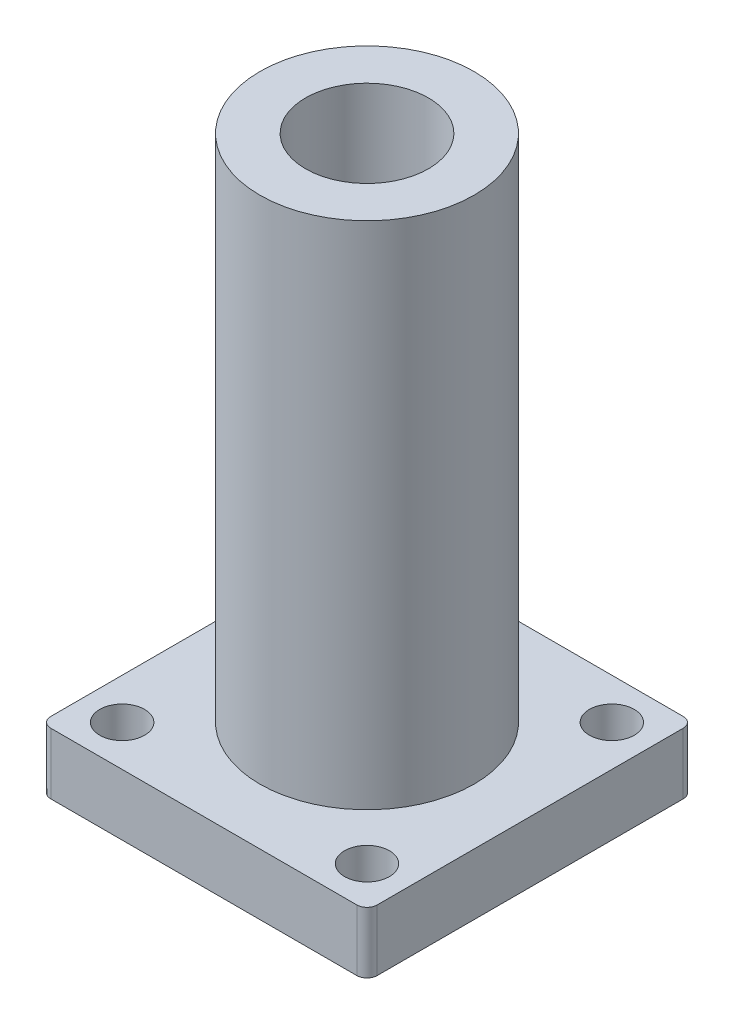
ISO-10303-21;
HEADER;
FILE_DESCRIPTION(('STEP AP214'),'2;1');
FILE_NAME('part.step','',(''),(''),'','','');
FILE_SCHEMA(('AUTOMOTIVE_DESIGN { 1 0 10303 214 1 1 1 1 }'));
ENDSEC;
DATA;
#1=APPLICATION_CONTEXT('core data for automotive mechanical design processes');
#2=APPLICATION_PROTOCOL_DEFINITION('international standard','automotive_design',2000,#1);
#3=PRODUCT_CONTEXT('',#1,'mechanical');
#4=PRODUCT('Part','Part','',(#3));
#5=PRODUCT_RELATED_PRODUCT_CATEGORY('part','',(#4));
#6=PRODUCT_DEFINITION_FORMATION('','',#4);
#7=PRODUCT_DEFINITION_CONTEXT('part definition',#1,'design');
#8=PRODUCT_DEFINITION('design','',#6,#7);
#9=PRODUCT_DEFINITION_SHAPE('','',#8);
#10=(LENGTH_UNIT() NAMED_UNIT(*) SI_UNIT(.MILLI.,.METRE.));
#11=(NAMED_UNIT(*) PLANE_ANGLE_UNIT() SI_UNIT($,.RADIAN.));
#12=(NAMED_UNIT(*) SI_UNIT($,.STERADIAN.) SOLID_ANGLE_UNIT());
#13=UNCERTAINTY_MEASURE_WITH_UNIT(LENGTH_MEASURE(1.E-05),#10,'distance_accuracy_value','');
#14=(GEOMETRIC_REPRESENTATION_CONTEXT(3) GLOBAL_UNCERTAINTY_ASSIGNED_CONTEXT((#13)) GLOBAL_UNIT_ASSIGNED_CONTEXT((#10,
#11,#12)) REPRESENTATION_CONTEXT('',''));
#15=CARTESIAN_POINT('',(0.,0.,0.));
#16=DIRECTION('',(0.,0.,1.));
#17=DIRECTION('',(1.,0.,0.));
#18=AXIS2_PLACEMENT_3D('',#15,#16,#17);
#19=CARTESIAN_POINT('',(0.,6.,-32.));
#20=DIRECTION('',(0.,0.,-1.));
#21=DIRECTION('',(-1.,0.,0.));
#22=AXIS2_PLACEMENT_3D('',#19,#20,#21);
#23=PLANE('',#22);
#24=DIRECTION('',(1.,0.,0.));
#25=VECTOR('',#24,1.);
#26=CARTESIAN_POINT('',(0.,6.,-32.));
#27=LINE('',#26,#25);
#28=CARTESIAN_POINT('',(0.999999999999999,6.,-32.));
#29=VERTEX_POINT('',#28);
#30=CARTESIAN_POINT('',(31.,6.,-32.));
#31=VERTEX_POINT('',#30);
#32=EDGE_CURVE('E155',#29,#31,#27,.T.);
#33=ORIENTED_EDGE('',*,*,#32,.T.);
#34=DIRECTION('',(0.,-1.,0.));
#35=VECTOR('',#34,1.);
#36=CARTESIAN_POINT('',(31.,6.,-32.));
#37=LINE('',#36,#35);
#38=CARTESIAN_POINT('',(31.,0.,-32.));
#39=VERTEX_POINT('',#38);
#40=EDGE_CURVE('E151',#31,#39,#37,.T.);
#41=ORIENTED_EDGE('',*,*,#40,.T.);
#42=DIRECTION('',(1.,0.,0.));
#43=VECTOR('',#42,1.);
#44=CARTESIAN_POINT('',(0.,0.,-32.));
#45=LINE('',#44,#43);
#46=CARTESIAN_POINT('',(0.999999999999999,0.,-32.));
#47=VERTEX_POINT('',#46);
#48=EDGE_CURVE('E103',#47,#39,#45,.T.);
#49=ORIENTED_EDGE('',*,*,#48,.F.);
#50=DIRECTION('',(0.,-1.,0.));
#51=VECTOR('',#50,1.);
#52=CARTESIAN_POINT('',(0.999999999999999,6.,-32.));
#53=LINE('',#52,#51);
#54=EDGE_CURVE('E149',#47,#29,#53,.F.);
#55=ORIENTED_EDGE('',*,*,#54,.T.);
#56=EDGE_LOOP('',(#33,#41,#49,#55));
#57=FACE_BOUND('',#56,.T.);
#58=ADVANCED_FACE('F32',(#57),#23,.T.);
#59=CARTESIAN_POINT('',(0.,6.,0.));
#60=DIRECTION('',(-1.,0.,0.));
#61=DIRECTION('',(0.,0.,1.));
#62=AXIS2_PLACEMENT_3D('',#59,#60,#61);
#63=PLANE('',#62);
#64=DIRECTION('',(0.,0.,-1.));
#65=VECTOR('',#64,1.);
#66=CARTESIAN_POINT('',(0.,6.,0.));
#67=LINE('',#66,#65);
#68=CARTESIAN_POINT('',(0.,6.,-1.));
#69=VERTEX_POINT('',#68);
#70=CARTESIAN_POINT('',(0.,6.,-31.));
#71=VERTEX_POINT('',#70);
#72=EDGE_CURVE('E129',#69,#71,#67,.T.);
#73=ORIENTED_EDGE('',*,*,#72,.T.);
#74=DIRECTION('',(0.,-1.,0.));
#75=VECTOR('',#74,1.);
#76=CARTESIAN_POINT('',(0.,6.,-31.));
#77=LINE('',#76,#75);
#78=CARTESIAN_POINT('',(0.,0.,-31.));
#79=VERTEX_POINT('',#78);
#80=EDGE_CURVE('E11',#71,#79,#77,.T.);
#81=ORIENTED_EDGE('',*,*,#80,.T.);
#82=DIRECTION('',(0.,0.,-1.));
#83=VECTOR('',#82,1.);
#84=CARTESIAN_POINT('',(0.,0.,0.));
#85=LINE('',#84,#83);
#86=CARTESIAN_POINT('',(0.,0.,-1.));
#87=VERTEX_POINT('',#86);
#88=EDGE_CURVE('E157',#87,#79,#85,.T.);
#89=ORIENTED_EDGE('',*,*,#88,.F.);
#90=DIRECTION('',(0.,-1.,0.));
#91=VECTOR('',#90,1.);
#92=CARTESIAN_POINT('',(0.,6.,-1.));
#93=LINE('',#92,#91);
#94=EDGE_CURVE('E40',#87,#69,#93,.F.);
#95=ORIENTED_EDGE('',*,*,#94,.T.);
#96=EDGE_LOOP('',(#73,#81,#89,#95));
#97=FACE_BOUND('',#96,.T.);
#98=ADVANCED_FACE('F189',(#97),#63,.T.);
#99=CARTESIAN_POINT('',(32.,6.,0.));
#100=DIRECTION('',(0.,0.,1.));
#101=DIRECTION('',(1.,0.,0.));
#102=AXIS2_PLACEMENT_3D('',#99,#100,#101);
#103=PLANE('',#102);
#104=DIRECTION('',(-1.,0.,0.));
#105=VECTOR('',#104,1.);
#106=CARTESIAN_POINT('',(32.,0.,0.));
#107=LINE('',#106,#105);
#108=CARTESIAN_POINT('',(31.,0.,0.));
#109=VERTEX_POINT('',#108);
#110=CARTESIAN_POINT('',(1.,0.,0.));
#111=VERTEX_POINT('',#110);
#112=EDGE_CURVE('E119',#109,#111,#107,.T.);
#113=ORIENTED_EDGE('',*,*,#112,.F.);
#114=DIRECTION('',(0.,-1.,0.));
#115=VECTOR('',#114,1.);
#116=CARTESIAN_POINT('',(31.,6.,0.));
#117=LINE('',#116,#115);
#118=CARTESIAN_POINT('',(31.,6.,0.));
#119=VERTEX_POINT('',#118);
#120=EDGE_CURVE('E141',#109,#119,#117,.F.);
#121=ORIENTED_EDGE('',*,*,#120,.T.);
#122=DIRECTION('',(-1.,0.,0.));
#123=VECTOR('',#122,1.);
#124=CARTESIAN_POINT('',(32.,6.,0.));
#125=LINE('',#124,#123);
#126=CARTESIAN_POINT('',(1.,6.,0.));
#127=VERTEX_POINT('',#126);
#128=EDGE_CURVE('E159',#119,#127,#125,.T.);
#129=ORIENTED_EDGE('',*,*,#128,.T.);
#130=DIRECTION('',(0.,-1.,0.));
#131=VECTOR('',#130,1.);
#132=CARTESIAN_POINT('',(1.,6.,0.));
#133=LINE('',#132,#131);
#134=EDGE_CURVE('E138',#127,#111,#133,.T.);
#135=ORIENTED_EDGE('',*,*,#134,.T.);
#136=EDGE_LOOP('',(#113,#121,#129,#135));
#137=FACE_BOUND('',#136,.T.);
#138=ADVANCED_FACE('F173',(#137),#103,.T.);
#139=CARTESIAN_POINT('',(32.,6.,-32.));
#140=DIRECTION('',(1.,0.,0.));
#141=DIRECTION('',(0.,0.,-1.));
#142=AXIS2_PLACEMENT_3D('',#139,#140,#141);
#143=PLANE('',#142);
#144=DIRECTION('',(0.,0.,1.));
#145=VECTOR('',#144,1.);
#146=CARTESIAN_POINT('',(32.,6.,-32.));
#147=LINE('',#146,#145);
#148=CARTESIAN_POINT('',(32.,6.,-31.));
#149=VERTEX_POINT('',#148);
#150=CARTESIAN_POINT('',(32.,6.,-1.));
#151=VERTEX_POINT('',#150);
#152=EDGE_CURVE('E156',#149,#151,#147,.T.);
#153=ORIENTED_EDGE('',*,*,#152,.T.);
#154=DIRECTION('',(0.,-1.,0.));
#155=VECTOR('',#154,1.);
#156=CARTESIAN_POINT('',(32.,6.,-1.));
#157=LINE('',#156,#155);
#158=CARTESIAN_POINT('',(32.,0.,-1.));
#159=VERTEX_POINT('',#158);
#160=EDGE_CURVE('E118',#151,#159,#157,.T.);
#161=ORIENTED_EDGE('',*,*,#160,.T.);
#162=DIRECTION('',(0.,0.,1.));
#163=VECTOR('',#162,1.);
#164=CARTESIAN_POINT('',(32.,0.,-32.));
#165=LINE('',#164,#163);
#166=CARTESIAN_POINT('',(32.,0.,-31.));
#167=VERTEX_POINT('',#166);
#168=EDGE_CURVE('E101',#167,#159,#165,.T.);
#169=ORIENTED_EDGE('',*,*,#168,.F.);
#170=DIRECTION('',(0.,-1.,0.));
#171=VECTOR('',#170,1.);
#172=CARTESIAN_POINT('',(32.,6.,-31.));
#173=LINE('',#172,#171);
#174=EDGE_CURVE('E115',#167,#149,#173,.F.);
#175=ORIENTED_EDGE('',*,*,#174,.T.);
#176=EDGE_LOOP('',(#153,#161,#169,#175));
#177=FACE_BOUND('',#176,.T.);
#178=ADVANCED_FACE('F114',(#177),#143,.T.);
#179=CARTESIAN_POINT('',(0.,6.,0.));
#180=DIRECTION('',(0.,-1.,0.));
#181=DIRECTION('',(0.,0.,-1.));
#182=AXIS2_PLACEMENT_3D('',#179,#180,#181);
#183=PLANE('',#182);
#184=CARTESIAN_POINT('',(28.,6.,-4.));
#185=DIRECTION('',(0.,-1.,0.));
#186=DIRECTION('',(0.,0.,-1.));
#187=AXIS2_PLACEMENT_3D('',#184,#185,#186);
#188=CIRCLE('',#187,2.19999999999999);
#189=CARTESIAN_POINT('',(28.,6.,-6.19999999999999));
#190=VERTEX_POINT('',#189);
#191=EDGE_CURVE('E338',#190,#190,#188,.T.);
#192=ORIENTED_EDGE('',*,*,#191,.T.);
#193=EDGE_LOOP('',(#192));
#194=FACE_BOUND('',#193,.T.);
#195=CARTESIAN_POINT('',(28.,6.,-28.));
#196=DIRECTION('',(0.,-1.,0.));
#197=DIRECTION('',(0.,0.,-1.));
#198=AXIS2_PLACEMENT_3D('',#195,#196,#197);
#199=CIRCLE('',#198,2.19999999999999);
#200=CARTESIAN_POINT('',(28.,6.,-30.2));
#201=VERTEX_POINT('',#200);
#202=EDGE_CURVE('E342',#201,#201,#199,.T.);
#203=ORIENTED_EDGE('',*,*,#202,.T.);
#204=EDGE_LOOP('',(#203));
#205=FACE_BOUND('',#204,.T.);
#206=CARTESIAN_POINT('',(4.00000005960464,6.,-4.00000005960464));
#207=DIRECTION('',(0.,-1.,0.));
#208=DIRECTION('',(0.,0.,-1.));
#209=AXIS2_PLACEMENT_3D('',#206,#207,#208);
#210=CIRCLE('',#209,2.19999999999999);
#211=CARTESIAN_POINT('',(4.00000005960464,6.,-6.20000005960463));
#212=VERTEX_POINT('',#211);
#213=EDGE_CURVE('E346',#212,#212,#210,.T.);
#214=ORIENTED_EDGE('',*,*,#213,.T.);
#215=EDGE_LOOP('',(#214));
#216=FACE_BOUND('',#215,.T.);
#217=CARTESIAN_POINT('',(4.00000005960464,6.,-28.0000004172325));
#218=DIRECTION('',(0.,-1.,0.));
#219=DIRECTION('',(0.,0.,-1.));
#220=AXIS2_PLACEMENT_3D('',#217,#218,#219);
#221=CIRCLE('',#220,2.19999999999999);
#222=CARTESIAN_POINT('',(4.00000005960464,6.,-30.2000004172325));
#223=VERTEX_POINT('',#222);
#224=EDGE_CURVE('E132',#223,#223,#221,.T.);
#225=ORIENTED_EDGE('',*,*,#224,.T.);
#226=EDGE_LOOP('',(#225));
#227=FACE_BOUND('',#226,.T.);
#228=CARTESIAN_POINT('',(16.0000002384186,6.,-16.0000002384186));
#229=DIRECTION('',(0.,1.,0.));
#230=DIRECTION('',(0.,0.,1.));
#231=AXIS2_PLACEMENT_3D('',#228,#229,#230);
#232=CIRCLE('',#231,10.5);
#233=CARTESIAN_POINT('',(16.0000002384186,6.,-5.50000023841861));
#234=VERTEX_POINT('',#233);
#235=EDGE_CURVE('E124',#234,#234,#232,.T.);
#236=ORIENTED_EDGE('',*,*,#235,.F.);
#237=EDGE_LOOP('',(#236));
#238=FACE_BOUND('',#237,.T.);
#239=ORIENTED_EDGE('',*,*,#128,.F.);
#240=CARTESIAN_POINT('',(31.,6.,-1.));
#241=DIRECTION('',(0.,-1.,0.));
#242=DIRECTION('',(0.,0.,-1.));
#243=AXIS2_PLACEMENT_3D('',#240,#241,#242);
#244=CIRCLE('',#243,1.);
#245=EDGE_CURVE('E147',#119,#151,#244,.F.);
#246=ORIENTED_EDGE('',*,*,#245,.T.);
#247=ORIENTED_EDGE('',*,*,#152,.F.);
#248=CARTESIAN_POINT('',(31.,6.,-31.));
#249=DIRECTION('',(0.,-1.,0.));
#250=DIRECTION('',(0.,0.,-1.));
#251=AXIS2_PLACEMENT_3D('',#248,#249,#250);
#252=CIRCLE('',#251,1.);
#253=EDGE_CURVE('E123',#149,#31,#252,.F.);
#254=ORIENTED_EDGE('',*,*,#253,.T.);
#255=ORIENTED_EDGE('',*,*,#32,.F.);
#256=CARTESIAN_POINT('',(0.999999999999999,6.,-31.));
#257=DIRECTION('',(0.,-1.,0.));
#258=DIRECTION('',(0.,0.,-1.));
#259=AXIS2_PLACEMENT_3D('',#256,#257,#258);
#260=CIRCLE('',#259,1.);
#261=EDGE_CURVE('E47',#29,#71,#260,.F.);
#262=ORIENTED_EDGE('',*,*,#261,.T.);
#263=ORIENTED_EDGE('',*,*,#72,.F.);
#264=CARTESIAN_POINT('',(1.,6.,-1.));
#265=DIRECTION('',(0.,-1.,0.));
#266=DIRECTION('',(0.,0.,-1.));
#267=AXIS2_PLACEMENT_3D('',#264,#265,#266);
#268=CIRCLE('',#267,1.);
#269=EDGE_CURVE('E143',#69,#127,#268,.F.);
#270=ORIENTED_EDGE('',*,*,#269,.T.);
#271=EDGE_LOOP('',(#239,#246,#247,#254,#255,#262,#263,#270));
#272=FACE_BOUND('',#271,.T.);
#273=ADVANCED_FACE('F179',(#194,#205,#216,#227,#238,#272),#183,.F.);
#274=CARTESIAN_POINT('',(0.,0.,0.));
#275=DIRECTION('',(0.,-1.,0.));
#276=DIRECTION('',(0.,0.,-1.));
#277=AXIS2_PLACEMENT_3D('',#274,#275,#276);
#278=PLANE('',#277);
#279=CARTESIAN_POINT('',(16.0000002384186,0.,-16.0000002384186));
#280=DIRECTION('',(0.,1.,0.));
#281=DIRECTION('',(0.,0.,1.));
#282=AXIS2_PLACEMENT_3D('',#279,#280,#281);
#283=CIRCLE('',#282,6.02500000000001);
#284=CARTESIAN_POINT('',(16.0000002384186,0.,-9.97500023841859));
#285=VERTEX_POINT('',#284);
#286=EDGE_CURVE('E371',#285,#285,#283,.T.);
#287=ORIENTED_EDGE('',*,*,#286,.T.);
#288=EDGE_LOOP('',(#287));
#289=FACE_BOUND('',#288,.T.);
#290=CARTESIAN_POINT('',(28.,0.,-4.));
#291=DIRECTION('',(0.,-1.,0.));
#292=DIRECTION('',(0.,0.,-1.));
#293=AXIS2_PLACEMENT_3D('',#290,#291,#292);
#294=CIRCLE('',#293,2.19999999999999);
#295=CARTESIAN_POINT('',(28.,0.,-6.19999999999999));
#296=VERTEX_POINT('',#295);
#297=EDGE_CURVE('E368',#296,#296,#294,.T.);
#298=ORIENTED_EDGE('',*,*,#297,.F.);
#299=EDGE_LOOP('',(#298));
#300=FACE_BOUND('',#299,.T.);
#301=CARTESIAN_POINT('',(28.,0.,-28.));
#302=DIRECTION('',(0.,-1.,0.));
#303=DIRECTION('',(0.,0.,-1.));
#304=AXIS2_PLACEMENT_3D('',#301,#302,#303);
#305=CIRCLE('',#304,2.19999999999999);
#306=CARTESIAN_POINT('',(28.,0.,-30.2));
#307=VERTEX_POINT('',#306);
#308=EDGE_CURVE('E364',#307,#307,#305,.T.);
#309=ORIENTED_EDGE('',*,*,#308,.F.);
#310=EDGE_LOOP('',(#309));
#311=FACE_BOUND('',#310,.T.);
#312=CARTESIAN_POINT('',(4.00000005960464,0.,-4.00000005960464));
#313=DIRECTION('',(0.,-1.,0.));
#314=DIRECTION('',(0.,0.,-1.));
#315=AXIS2_PLACEMENT_3D('',#312,#313,#314);
#316=CIRCLE('',#315,2.19999999999999);
#317=CARTESIAN_POINT('',(4.00000005960464,0.,-6.20000005960463));
#318=VERTEX_POINT('',#317);
#319=EDGE_CURVE('E360',#318,#318,#316,.T.);
#320=ORIENTED_EDGE('',*,*,#319,.F.);
#321=EDGE_LOOP('',(#320));
#322=FACE_BOUND('',#321,.T.);
#323=CARTESIAN_POINT('',(4.00000005960464,0.,-28.0000004172325));
#324=DIRECTION('',(0.,-1.,0.));
#325=DIRECTION('',(0.,0.,-1.));
#326=AXIS2_PLACEMENT_3D('',#323,#324,#325);
#327=CIRCLE('',#326,2.19999999999999);
#328=CARTESIAN_POINT('',(4.00000005960464,0.,-30.2000004172325));
#329=VERTEX_POINT('',#328);
#330=EDGE_CURVE('E355',#329,#329,#327,.T.);
#331=ORIENTED_EDGE('',*,*,#330,.F.);
#332=EDGE_LOOP('',(#331));
#333=FACE_BOUND('',#332,.T.);
#334=ORIENTED_EDGE('',*,*,#168,.T.);
#335=CARTESIAN_POINT('',(31.,0.,-1.));
#336=DIRECTION('',(0.,-1.,0.));
#337=DIRECTION('',(0.,0.,-1.));
#338=AXIS2_PLACEMENT_3D('',#335,#336,#337);
#339=CIRCLE('',#338,1.);
#340=EDGE_CURVE('E108',#159,#109,#339,.T.);
#341=ORIENTED_EDGE('',*,*,#340,.T.);
#342=ORIENTED_EDGE('',*,*,#112,.T.);
#343=CARTESIAN_POINT('',(1.,0.,-1.));
#344=DIRECTION('',(0.,-1.,0.));
#345=DIRECTION('',(0.,0.,-1.));
#346=AXIS2_PLACEMENT_3D('',#343,#344,#345);
#347=CIRCLE('',#346,1.);
#348=EDGE_CURVE('E126',#111,#87,#347,.T.);
#349=ORIENTED_EDGE('',*,*,#348,.T.);
#350=ORIENTED_EDGE('',*,*,#88,.T.);
#351=CARTESIAN_POINT('',(0.999999999999999,0.,-31.));
#352=DIRECTION('',(0.,-1.,0.));
#353=DIRECTION('',(0.,0.,-1.));
#354=AXIS2_PLACEMENT_3D('',#351,#352,#353);
#355=CIRCLE('',#354,1.);
#356=EDGE_CURVE('E109',#79,#47,#355,.T.);
#357=ORIENTED_EDGE('',*,*,#356,.T.);
#358=ORIENTED_EDGE('',*,*,#48,.T.);
#359=CARTESIAN_POINT('',(31.,0.,-31.));
#360=DIRECTION('',(0.,-1.,0.));
#361=DIRECTION('',(0.,0.,-1.));
#362=AXIS2_PLACEMENT_3D('',#359,#360,#361);
#363=CIRCLE('',#362,1.);
#364=EDGE_CURVE('E98',#39,#167,#363,.T.);
#365=ORIENTED_EDGE('',*,*,#364,.T.);
#366=EDGE_LOOP('',(#334,#341,#342,#349,#350,#357,#358,#365));
#367=FACE_BOUND('',#366,.T.);
#368=ADVANCED_FACE('F100',(#289,#300,#311,#322,#333,#367),#278,.T.);
#369=CARTESIAN_POINT('',(16.0000002384186,6.,-16.0000002384186));
#370=DIRECTION('',(0.,1.,0.));
#371=DIRECTION('',(0.,0.,1.));
#372=AXIS2_PLACEMENT_3D('',#369,#370,#371);
#373=CYLINDRICAL_SURFACE('',#372,10.5);
#374=ORIENTED_EDGE('',*,*,#235,.T.);
#375=EDGE_LOOP('',(#374));
#376=FACE_BOUND('',#375,.T.);
#377=CARTESIAN_POINT('',(16.0000002384186,56.,-16.0000002384186));
#378=DIRECTION('',(0.,1.,0.));
#379=DIRECTION('',(0.,0.,1.));
#380=AXIS2_PLACEMENT_3D('',#377,#378,#379);
#381=CIRCLE('',#380,10.5);
#382=CARTESIAN_POINT('',(16.0000002384186,56.,-5.5000002384186));
#383=VERTEX_POINT('',#382);
#384=EDGE_CURVE('E167',#383,#383,#381,.T.);
#385=ORIENTED_EDGE('',*,*,#384,.F.);
#386=EDGE_LOOP('',(#385));
#387=FACE_BOUND('',#386,.T.);
#388=ADVANCED_FACE('F277',(#376,#387),#373,.T.);
#389=CARTESIAN_POINT('',(16.0000002384186,56.,-16.0000002384186));
#390=DIRECTION('',(0.,1.,0.));
#391=DIRECTION('',(0.,0.,1.));
#392=AXIS2_PLACEMENT_3D('',#389,#390,#391);
#393=PLANE('',#392);
#394=CARTESIAN_POINT('',(16.0000002384186,56.,-16.0000002384186));
#395=DIRECTION('',(0.,1.,0.));
#396=DIRECTION('',(0.,0.,1.));
#397=AXIS2_PLACEMENT_3D('',#394,#395,#396);
#398=CIRCLE('',#397,6.02500000000001);
#399=CARTESIAN_POINT('',(16.0000002384186,56.,-9.97500023841859));
#400=VERTEX_POINT('',#399);
#401=EDGE_CURVE('E374',#400,#400,#398,.T.);
#402=ORIENTED_EDGE('',*,*,#401,.F.);
#403=EDGE_LOOP('',(#402));
#404=FACE_BOUND('',#403,.T.);
#405=ORIENTED_EDGE('',*,*,#384,.T.);
#406=EDGE_LOOP('',(#405));
#407=FACE_BOUND('',#406,.T.);
#408=ADVANCED_FACE('F268',(#404,#407),#393,.T.);
#409=CARTESIAN_POINT('',(4.00000005960464,0.,-28.0000004172325));
#410=DIRECTION('',(0.,-1.,0.));
#411=DIRECTION('',(0.,0.,-1.));
#412=AXIS2_PLACEMENT_3D('',#409,#410,#411);
#413=CYLINDRICAL_SURFACE('',#412,2.19999999999999);
#414=ORIENTED_EDGE('',*,*,#330,.T.);
#415=EDGE_LOOP('',(#414));
#416=FACE_BOUND('',#415,.T.);
#417=ORIENTED_EDGE('',*,*,#224,.F.);
#418=EDGE_LOOP('',(#417));
#419=FACE_BOUND('',#418,.T.);
#420=ADVANCED_FACE('F259',(#416,#419),#413,.F.);
#421=CARTESIAN_POINT('',(4.00000005960464,0.,-4.00000005960464));
#422=DIRECTION('',(0.,-1.,0.));
#423=DIRECTION('',(0.,0.,-1.));
#424=AXIS2_PLACEMENT_3D('',#421,#422,#423);
#425=CYLINDRICAL_SURFACE('',#424,2.19999999999999);
#426=ORIENTED_EDGE('',*,*,#319,.T.);
#427=EDGE_LOOP('',(#426));
#428=FACE_BOUND('',#427,.T.);
#429=ORIENTED_EDGE('',*,*,#213,.F.);
#430=EDGE_LOOP('',(#429));
#431=FACE_BOUND('',#430,.T.);
#432=ADVANCED_FACE('F250',(#428,#431),#425,.F.);
#433=CARTESIAN_POINT('',(28.,0.,-28.));
#434=DIRECTION('',(0.,-1.,0.));
#435=DIRECTION('',(0.,0.,-1.));
#436=AXIS2_PLACEMENT_3D('',#433,#434,#435);
#437=CYLINDRICAL_SURFACE('',#436,2.19999999999999);
#438=ORIENTED_EDGE('',*,*,#308,.T.);
#439=EDGE_LOOP('',(#438));
#440=FACE_BOUND('',#439,.T.);
#441=ORIENTED_EDGE('',*,*,#202,.F.);
#442=EDGE_LOOP('',(#441));
#443=FACE_BOUND('',#442,.T.);
#444=ADVANCED_FACE('F241',(#440,#443),#437,.F.);
#445=CARTESIAN_POINT('',(28.,0.,-4.));
#446=DIRECTION('',(0.,-1.,0.));
#447=DIRECTION('',(0.,0.,-1.));
#448=AXIS2_PLACEMENT_3D('',#445,#446,#447);
#449=CYLINDRICAL_SURFACE('',#448,2.19999999999999);
#450=ORIENTED_EDGE('',*,*,#297,.T.);
#451=EDGE_LOOP('',(#450));
#452=FACE_BOUND('',#451,.T.);
#453=ORIENTED_EDGE('',*,*,#191,.F.);
#454=EDGE_LOOP('',(#453));
#455=FACE_BOUND('',#454,.T.);
#456=ADVANCED_FACE('F231',(#452,#455),#449,.F.);
#457=CARTESIAN_POINT('',(16.0000002384186,56.,-16.0000002384186));
#458=DIRECTION('',(0.,1.,0.));
#459=DIRECTION('',(0.,0.,1.));
#460=AXIS2_PLACEMENT_3D('',#457,#458,#459);
#461=CYLINDRICAL_SURFACE('',#460,6.02500000000001);
#462=ORIENTED_EDGE('',*,*,#286,.F.);
#463=EDGE_LOOP('',(#462));
#464=FACE_BOUND('',#463,.T.);
#465=ORIENTED_EDGE('',*,*,#401,.T.);
#466=EDGE_LOOP('',(#465));
#467=FACE_BOUND('',#466,.T.);
#468=ADVANCED_FACE('F200',(#464,#467),#461,.F.);
#469=CARTESIAN_POINT('',(31.,6.,-1.));
#470=DIRECTION('',(0.,-1.,0.));
#471=DIRECTION('',(0.,0.,-1.));
#472=AXIS2_PLACEMENT_3D('',#469,#470,#471);
#473=CYLINDRICAL_SURFACE('',#472,1.);
#474=ORIENTED_EDGE('',*,*,#245,.F.);
#475=ORIENTED_EDGE('',*,*,#120,.F.);
#476=ORIENTED_EDGE('',*,*,#340,.F.);
#477=ORIENTED_EDGE('',*,*,#160,.F.);
#478=EDGE_LOOP('',(#474,#475,#476,#477));
#479=FACE_BOUND('',#478,.T.);
#480=ADVANCED_FACE('F178',(#479),#473,.T.);
#481=CARTESIAN_POINT('',(31.,6.,-31.));
#482=DIRECTION('',(0.,-1.,0.));
#483=DIRECTION('',(0.,0.,-1.));
#484=AXIS2_PLACEMENT_3D('',#481,#482,#483);
#485=CYLINDRICAL_SURFACE('',#484,1.);
#486=ORIENTED_EDGE('',*,*,#253,.F.);
#487=ORIENTED_EDGE('',*,*,#174,.F.);
#488=ORIENTED_EDGE('',*,*,#364,.F.);
#489=ORIENTED_EDGE('',*,*,#40,.F.);
#490=EDGE_LOOP('',(#486,#487,#488,#489));
#491=FACE_BOUND('',#490,.T.);
#492=ADVANCED_FACE('F122',(#491),#485,.T.);
#493=CARTESIAN_POINT('',(0.999999999999999,6.,-31.));
#494=DIRECTION('',(0.,-1.,0.));
#495=DIRECTION('',(0.,0.,-1.));
#496=AXIS2_PLACEMENT_3D('',#493,#494,#495);
#497=CYLINDRICAL_SURFACE('',#496,1.);
#498=ORIENTED_EDGE('',*,*,#261,.F.);
#499=ORIENTED_EDGE('',*,*,#54,.F.);
#500=ORIENTED_EDGE('',*,*,#356,.F.);
#501=ORIENTED_EDGE('',*,*,#80,.F.);
#502=EDGE_LOOP('',(#498,#499,#500,#501));
#503=FACE_BOUND('',#502,.T.);
#504=ADVANCED_FACE('F183',(#503),#497,.T.);
#505=CARTESIAN_POINT('',(1.,6.,-1.));
#506=DIRECTION('',(0.,-1.,0.));
#507=DIRECTION('',(0.,0.,-1.));
#508=AXIS2_PLACEMENT_3D('',#505,#506,#507);
#509=CYLINDRICAL_SURFACE('',#508,1.);
#510=ORIENTED_EDGE('',*,*,#269,.F.);
#511=ORIENTED_EDGE('',*,*,#94,.F.);
#512=ORIENTED_EDGE('',*,*,#348,.F.);
#513=ORIENTED_EDGE('',*,*,#134,.F.);
#514=EDGE_LOOP('',(#510,#511,#512,#513));
#515=FACE_BOUND('',#514,.T.);
#516=ADVANCED_FACE('F34',(#515),#509,.T.);
#517=CLOSED_SHELL('',(#58,#98,#138,#178,#273,#368,#388,#408,#420,#432,#444,#456,#468,#480,#492,
#504,#516));
#518=MANIFOLD_SOLID_BREP('B2',#517);
#519=ADVANCED_BREP_SHAPE_REPRESENTATION('',(#18,#518),#14);
#520=SHAPE_DEFINITION_REPRESENTATION(#9,#519);
ENDSEC;
END-ISO-10303-21;
